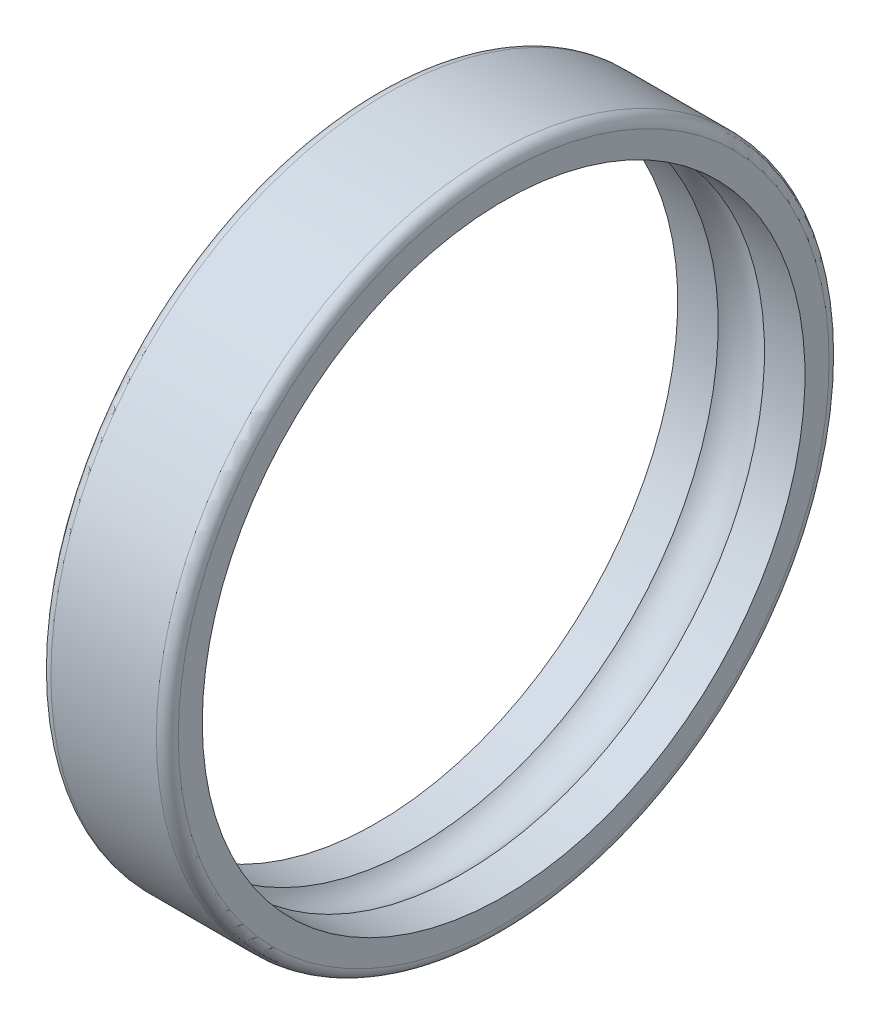
ISO-10303-21;
HEADER;
FILE_DESCRIPTION(('STEP AP214'),'2;1');
FILE_NAME('part.step','',(''),(''),'','','');
FILE_SCHEMA(('AUTOMOTIVE_DESIGN { 1 0 10303 214 1 1 1 1 }'));
ENDSEC;
DATA;
#1=APPLICATION_CONTEXT('core data for automotive mechanical design processes');
#2=APPLICATION_PROTOCOL_DEFINITION('international standard','automotive_design',2000,#1);
#3=PRODUCT_CONTEXT('',#1,'mechanical');
#4=PRODUCT('Part','Part','',(#3));
#5=PRODUCT_RELATED_PRODUCT_CATEGORY('part','',(#4));
#6=PRODUCT_DEFINITION_FORMATION('','',#4);
#7=PRODUCT_DEFINITION_CONTEXT('part definition',#1,'design');
#8=PRODUCT_DEFINITION('design','',#6,#7);
#9=PRODUCT_DEFINITION_SHAPE('','',#8);
#10=(LENGTH_UNIT() NAMED_UNIT(*) SI_UNIT(.MILLI.,.METRE.));
#11=(NAMED_UNIT(*) PLANE_ANGLE_UNIT() SI_UNIT($,.RADIAN.));
#12=(NAMED_UNIT(*) SI_UNIT($,.STERADIAN.) SOLID_ANGLE_UNIT());
#13=UNCERTAINTY_MEASURE_WITH_UNIT(LENGTH_MEASURE(1.E-05),#10,'distance_accuracy_value','');
#14=(GEOMETRIC_REPRESENTATION_CONTEXT(3) GLOBAL_UNCERTAINTY_ASSIGNED_CONTEXT((#13)) GLOBAL_UNIT_ASSIGNED_CONTEXT((#10,
#11,#12)) REPRESENTATION_CONTEXT('',''));
#15=CARTESIAN_POINT('',(0.,0.,0.));
#16=DIRECTION('',(0.,0.,1.));
#17=DIRECTION('',(1.,0.,0.));
#18=AXIS2_PLACEMENT_3D('',#15,#16,#17);
#19=CARTESIAN_POINT('',(3.5,0.,0.));
#20=DIRECTION('',(1.,0.,0.));
#21=DIRECTION('',(0.,0.,-1.));
#22=AXIS2_PLACEMENT_3D('',#19,#20,#21);
#23=TOROIDAL_SURFACE('',#22,15.375,1.75);
#24=CARTESIAN_POINT('',(4.77377392028569,0.,0.));
#25=DIRECTION('',(-1.,0.,0.));
#26=DIRECTION('',(0.,0.,1.));
#27=AXIS2_PLACEMENT_3D('',#24,#25,#26);
#28=CIRCLE('',#27,16.575);
#29=CARTESIAN_POINT('',(4.77377392028569,0.,16.575));
#30=VERTEX_POINT('',#29);
#31=EDGE_CURVE('E108',#30,#30,#28,.F.);
#32=ORIENTED_EDGE('',*,*,#31,.T.);
#33=EDGE_LOOP('',(#32));
#34=FACE_BOUND('',#33,.T.);
#35=CARTESIAN_POINT('',(2.22622607971429,0.,0.));
#36=DIRECTION('',(-1.,0.,0.));
#37=DIRECTION('',(0.,0.,1.));
#38=AXIS2_PLACEMENT_3D('',#35,#36,#37);
#39=CIRCLE('',#38,16.575);
#40=CARTESIAN_POINT('',(2.22622607971429,0.,16.575));
#41=VERTEX_POINT('',#40);
#42=EDGE_CURVE('E113',#41,#41,#39,.T.);
#43=ORIENTED_EDGE('',*,*,#42,.T.);
#44=EDGE_LOOP('',(#43));
#45=FACE_BOUND('',#44,.T.);
#46=ADVANCED_FACE('F14',(#34,#45),#23,.F.);
#47=CARTESIAN_POINT('',(200.,0.,0.));
#48=DIRECTION('',(-1.,0.,0.));
#49=DIRECTION('',(0.,0.,1.));
#50=AXIS2_PLACEMENT_3D('',#47,#48,#49);
#51=CYLINDRICAL_SURFACE('',#50,16.575);
#52=CARTESIAN_POINT('',(0.,0.,0.));
#53=DIRECTION('',(-1.,0.,0.));
#54=DIRECTION('',(0.,0.,1.));
#55=AXIS2_PLACEMENT_3D('',#52,#53,#54);
#56=CIRCLE('',#55,16.575);
#57=CARTESIAN_POINT('',(0.,0.,16.575));
#58=VERTEX_POINT('',#57);
#59=EDGE_CURVE('E18',#58,#58,#56,.F.);
#60=ORIENTED_EDGE('',*,*,#59,.F.);
#61=EDGE_LOOP('',(#60));
#62=FACE_BOUND('',#61,.T.);
#63=ORIENTED_EDGE('',*,*,#42,.F.);
#64=EDGE_LOOP('',(#63));
#65=FACE_BOUND('',#64,.T.);
#66=ADVANCED_FACE('F84',(#62,#65),#51,.F.);
#67=CARTESIAN_POINT('',(200.,0.,0.));
#68=DIRECTION('',(-1.,0.,0.));
#69=DIRECTION('',(0.,0.,1.));
#70=AXIS2_PLACEMENT_3D('',#67,#68,#69);
#71=CYLINDRICAL_SURFACE('',#70,16.575);
#72=ORIENTED_EDGE('',*,*,#31,.F.);
#73=EDGE_LOOP('',(#72));
#74=FACE_BOUND('',#73,.T.);
#75=CARTESIAN_POINT('',(7.00000000000001,0.,0.));
#76=DIRECTION('',(-1.,0.,0.));
#77=DIRECTION('',(0.,0.,1.));
#78=AXIS2_PLACEMENT_3D('',#75,#76,#77);
#79=CIRCLE('',#78,16.575);
#80=CARTESIAN_POINT('',(7.00000000000001,0.,16.575));
#81=VERTEX_POINT('',#80);
#82=EDGE_CURVE('E103',#81,#81,#79,.T.);
#83=ORIENTED_EDGE('',*,*,#82,.F.);
#84=EDGE_LOOP('',(#83));
#85=FACE_BOUND('',#84,.T.);
#86=ADVANCED_FACE('F81',(#74,#85),#71,.F.);
#87=CARTESIAN_POINT('',(0.,17.9,0.));
#88=DIRECTION('',(-1.,0.,0.));
#89=DIRECTION('',(0.,0.,1.));
#90=AXIS2_PLACEMENT_3D('',#87,#88,#89);
#91=PLANE('',#90);
#92=CARTESIAN_POINT('',(0.,0.,0.));
#93=DIRECTION('',(1.,0.,0.));
#94=DIRECTION('',(0.,0.,-1.));
#95=AXIS2_PLACEMENT_3D('',#92,#93,#94);
#96=CIRCLE('',#95,17.9);
#97=CARTESIAN_POINT('',(0.,0.,-17.9));
#98=VERTEX_POINT('',#97);
#99=EDGE_CURVE('E65',#98,#98,#96,.T.);
#100=ORIENTED_EDGE('',*,*,#99,.F.);
#101=EDGE_LOOP('',(#100));
#102=FACE_BOUND('',#101,.T.);
#103=ORIENTED_EDGE('',*,*,#59,.T.);
#104=EDGE_LOOP('',(#103));
#105=FACE_BOUND('',#104,.T.);
#106=ADVANCED_FACE('F71',(#102,#105),#91,.T.);
#107=CARTESIAN_POINT('',(7.,16.575,0.));
#108=DIRECTION('',(1.,0.,0.));
#109=DIRECTION('',(0.,0.,-1.));
#110=AXIS2_PLACEMENT_3D('',#107,#108,#109);
#111=PLANE('',#110);
#112=ORIENTED_EDGE('',*,*,#82,.T.);
#113=EDGE_LOOP('',(#112));
#114=FACE_BOUND('',#113,.T.);
#115=CARTESIAN_POINT('',(7.,0.,0.));
#116=DIRECTION('',(-1.,0.,0.));
#117=DIRECTION('',(0.,0.,-1.));
#118=AXIS2_PLACEMENT_3D('',#115,#116,#117);
#119=CIRCLE('',#118,17.9);
#120=CARTESIAN_POINT('',(7.,0.,-17.9));
#121=VERTEX_POINT('',#120);
#122=EDGE_CURVE('E27',#121,#121,#119,.T.);
#123=ORIENTED_EDGE('',*,*,#122,.F.);
#124=EDGE_LOOP('',(#123));
#125=FACE_BOUND('',#124,.T.);
#126=ADVANCED_FACE('F80',(#114,#125),#111,.T.);
#127=CARTESIAN_POINT('',(0.599999999999997,0.,0.));
#128=DIRECTION('',(1.,0.,0.));
#129=DIRECTION('',(0.,0.,-1.));
#130=AXIS2_PLACEMENT_3D('',#127,#128,#129);
#131=TOROIDAL_SURFACE('',#130,17.9,0.599999999999996);
#132=CARTESIAN_POINT('',(0.599999999999989,0.,0.));
#133=DIRECTION('',(-1.,0.,0.));
#134=DIRECTION('',(0.,0.,1.));
#135=AXIS2_PLACEMENT_3D('',#132,#133,#134);
#136=CIRCLE('',#135,18.5);
#137=CARTESIAN_POINT('',(0.599999999999989,0.,18.5));
#138=VERTEX_POINT('',#137);
#139=EDGE_CURVE('E22',#138,#138,#136,.F.);
#140=ORIENTED_EDGE('',*,*,#139,.F.);
#141=EDGE_LOOP('',(#140));
#142=FACE_BOUND('',#141,.T.);
#143=ORIENTED_EDGE('',*,*,#99,.T.);
#144=EDGE_LOOP('',(#143));
#145=FACE_BOUND('',#144,.T.);
#146=ADVANCED_FACE('F45',(#142,#145),#131,.T.);
#147=CARTESIAN_POINT('',(6.4,0.,0.));
#148=DIRECTION('',(1.,0.,0.));
#149=DIRECTION('',(0.,0.,-1.));
#150=AXIS2_PLACEMENT_3D('',#147,#148,#149);
#151=TOROIDAL_SURFACE('',#150,17.9,0.599999999999996);
#152=ORIENTED_EDGE('',*,*,#122,.T.);
#153=EDGE_LOOP('',(#152));
#154=FACE_BOUND('',#153,.T.);
#155=CARTESIAN_POINT('',(6.40000000000002,0.,0.));
#156=DIRECTION('',(-1.,0.,0.));
#157=DIRECTION('',(0.,0.,1.));
#158=AXIS2_PLACEMENT_3D('',#155,#156,#157);
#159=CIRCLE('',#158,18.5);
#160=CARTESIAN_POINT('',(6.40000000000002,0.,18.5));
#161=VERTEX_POINT('',#160);
#162=EDGE_CURVE('E10',#161,#161,#159,.T.);
#163=ORIENTED_EDGE('',*,*,#162,.F.);
#164=EDGE_LOOP('',(#163));
#165=FACE_BOUND('',#164,.T.);
#166=ADVANCED_FACE('F39',(#154,#165),#151,.T.);
#167=CARTESIAN_POINT('',(200.,0.,0.));
#168=DIRECTION('',(-1.,0.,0.));
#169=DIRECTION('',(0.,0.,1.));
#170=AXIS2_PLACEMENT_3D('',#167,#168,#169);
#171=CYLINDRICAL_SURFACE('',#170,18.5);
#172=ORIENTED_EDGE('',*,*,#162,.T.);
#173=EDGE_LOOP('',(#172));
#174=FACE_BOUND('',#173,.T.);
#175=ORIENTED_EDGE('',*,*,#139,.T.);
#176=EDGE_LOOP('',(#175));
#177=FACE_BOUND('',#176,.T.);
#178=ADVANCED_FACE('F44',(#174,#177),#171,.T.);
#179=CLOSED_SHELL('',(#46,#66,#86,#106,#126,#146,#166,#178));
#180=MANIFOLD_SOLID_BREP('B1',#179);
#181=ADVANCED_BREP_SHAPE_REPRESENTATION('',(#18,#180),#14);
#182=SHAPE_DEFINITION_REPRESENTATION(#9,#181);
ENDSEC;
END-ISO-10303-21;
